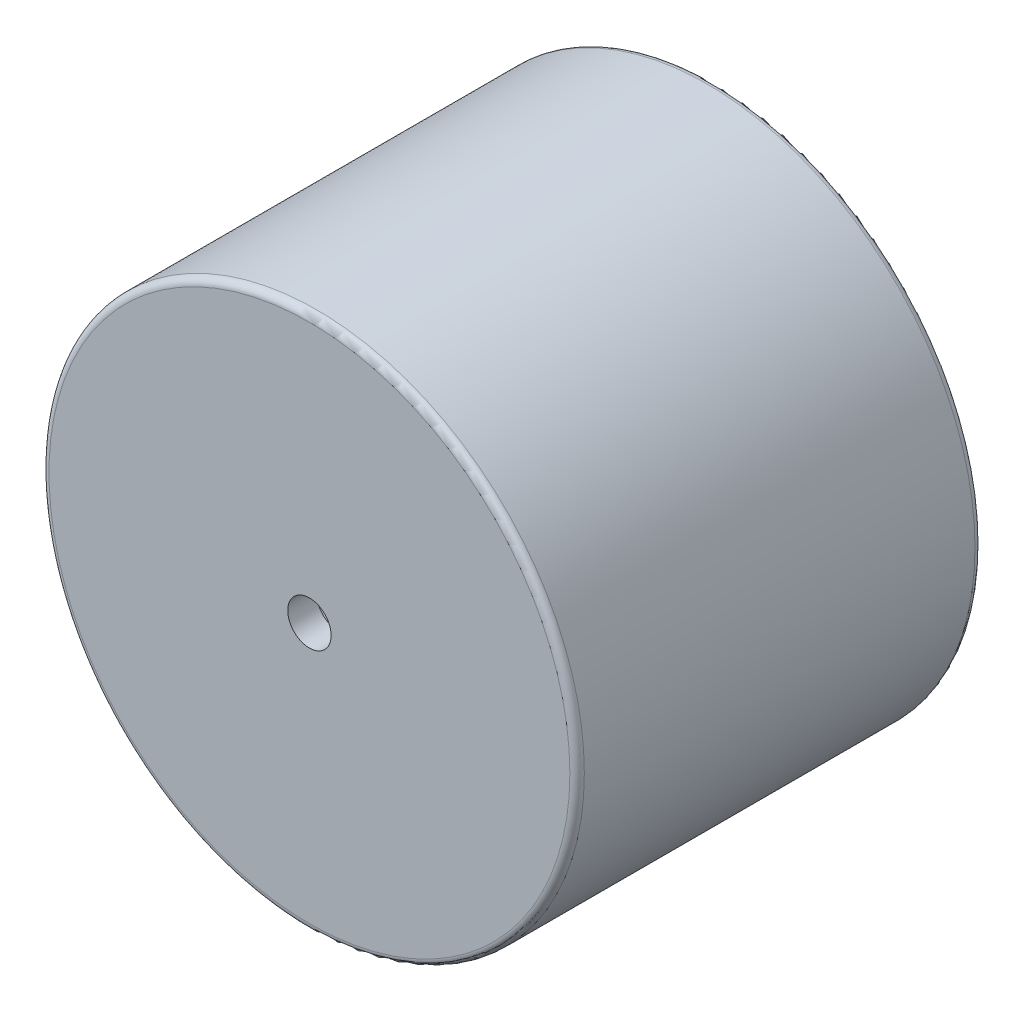
ISO-10303-21;
HEADER;
FILE_DESCRIPTION(('STEP AP214'),'2;1');
FILE_NAME('part.step','',(''),(''),'','','');
FILE_SCHEMA(('AUTOMOTIVE_DESIGN { 1 0 10303 214 1 1 1 1 }'));
ENDSEC;
DATA;
#1=APPLICATION_CONTEXT('core data for automotive mechanical design processes');
#2=APPLICATION_PROTOCOL_DEFINITION('international standard','automotive_design',2000,#1);
#3=PRODUCT_CONTEXT('',#1,'mechanical');
#4=PRODUCT('Part','Part','',(#3));
#5=PRODUCT_RELATED_PRODUCT_CATEGORY('part','',(#4));
#6=PRODUCT_DEFINITION_FORMATION('','',#4);
#7=PRODUCT_DEFINITION_CONTEXT('part definition',#1,'design');
#8=PRODUCT_DEFINITION('design','',#6,#7);
#9=PRODUCT_DEFINITION_SHAPE('','',#8);
#10=(LENGTH_UNIT() NAMED_UNIT(*) SI_UNIT(.MILLI.,.METRE.));
#11=(NAMED_UNIT(*) PLANE_ANGLE_UNIT() SI_UNIT($,.RADIAN.));
#12=(NAMED_UNIT(*) SI_UNIT($,.STERADIAN.) SOLID_ANGLE_UNIT());
#13=UNCERTAINTY_MEASURE_WITH_UNIT(LENGTH_MEASURE(1.E-05),#10,'distance_accuracy_value','');
#14=(GEOMETRIC_REPRESENTATION_CONTEXT(3) GLOBAL_UNCERTAINTY_ASSIGNED_CONTEXT((#13)) GLOBAL_UNIT_ASSIGNED_CONTEXT((#10,
#11,#12)) REPRESENTATION_CONTEXT('',''));
#15=CARTESIAN_POINT('',(0.,0.,0.));
#16=DIRECTION('',(0.,0.,1.));
#17=DIRECTION('',(1.,0.,0.));
#18=AXIS2_PLACEMENT_3D('',#15,#16,#17);
#19=CARTESIAN_POINT('',(0.,0.,2.));
#20=DIRECTION('',(0.,0.,1.));
#21=DIRECTION('',(1.,0.,0.));
#22=AXIS2_PLACEMENT_3D('',#19,#20,#21);
#23=PLANE('',#22);
#24=CARTESIAN_POINT('',(15.,0.,2.));
#25=DIRECTION('',(0.,0.,1.));
#26=DIRECTION('',(1.,0.,0.));
#27=AXIS2_PLACEMENT_3D('',#24,#25,#26);
#28=CIRCLE('',#27,1.);
#29=CARTESIAN_POINT('',(16.,0.,2.));
#30=VERTEX_POINT('',#29);
#31=EDGE_CURVE('E107',#30,#30,#28,.F.);
#32=ORIENTED_EDGE('',*,*,#31,.T.);
#33=EDGE_LOOP('',(#32));
#34=FACE_BOUND('',#33,.T.);
#35=CARTESIAN_POINT('',(7.49999999999999,-12.9903810567666,2.));
#36=DIRECTION('',(0.,0.,1.));
#37=DIRECTION('',(1.,0.,0.));
#38=AXIS2_PLACEMENT_3D('',#35,#36,#37);
#39=CIRCLE('',#38,1.);
#40=CARTESIAN_POINT('',(8.49999999999999,-12.9903810567666,2.));
#41=VERTEX_POINT('',#40);
#42=EDGE_CURVE('E105',#41,#41,#39,.F.);
#43=ORIENTED_EDGE('',*,*,#42,.T.);
#44=EDGE_LOOP('',(#43));
#45=FACE_BOUND('',#44,.T.);
#46=CARTESIAN_POINT('',(-7.50000000000001,-12.9903810567666,2.));
#47=DIRECTION('',(0.,0.,1.));
#48=DIRECTION('',(1.,0.,0.));
#49=AXIS2_PLACEMENT_3D('',#46,#47,#48);
#50=CIRCLE('',#49,1.);
#51=CARTESIAN_POINT('',(-6.5,-12.9903810567666,2.));
#52=VERTEX_POINT('',#51);
#53=EDGE_CURVE('E120',#52,#52,#50,.F.);
#54=ORIENTED_EDGE('',*,*,#53,.T.);
#55=EDGE_LOOP('',(#54));
#56=FACE_BOUND('',#55,.T.);
#57=CARTESIAN_POINT('',(-15.,0.,2.));
#58=DIRECTION('',(0.,0.,1.));
#59=DIRECTION('',(1.,0.,0.));
#60=AXIS2_PLACEMENT_3D('',#57,#58,#59);
#61=CIRCLE('',#60,1.);
#62=CARTESIAN_POINT('',(-14.,0.,2.));
#63=VERTEX_POINT('',#62);
#64=EDGE_CURVE('E133',#63,#63,#61,.F.);
#65=ORIENTED_EDGE('',*,*,#64,.T.);
#66=EDGE_LOOP('',(#65));
#67=FACE_BOUND('',#66,.T.);
#68=CARTESIAN_POINT('',(-7.5,12.9903810567666,2.));
#69=DIRECTION('',(0.,0.,1.));
#70=DIRECTION('',(1.,0.,0.));
#71=AXIS2_PLACEMENT_3D('',#68,#69,#70);
#72=CIRCLE('',#71,1.);
#73=CARTESIAN_POINT('',(-6.49999999999999,12.9903810567666,2.));
#74=VERTEX_POINT('',#73);
#75=EDGE_CURVE('E127',#74,#74,#72,.F.);
#76=ORIENTED_EDGE('',*,*,#75,.T.);
#77=EDGE_LOOP('',(#76));
#78=FACE_BOUND('',#77,.T.);
#79=CARTESIAN_POINT('',(7.50000000000001,12.9903810567666,2.));
#80=DIRECTION('',(0.,0.,1.));
#81=DIRECTION('',(1.,0.,0.));
#82=AXIS2_PLACEMENT_3D('',#79,#80,#81);
#83=CIRCLE('',#82,1.);
#84=CARTESIAN_POINT('',(8.50000000000001,12.9903810567666,2.));
#85=VERTEX_POINT('',#84);
#86=EDGE_CURVE('E121',#85,#85,#83,.F.);
#87=ORIENTED_EDGE('',*,*,#86,.T.);
#88=EDGE_LOOP('',(#87));
#89=FACE_BOUND('',#88,.T.);
#90=CARTESIAN_POINT('',(-5.39168837326284,-7.82174510487412,2.));
#91=DIRECTION('',(0.,0.,1.));
#92=DIRECTION('',(1.,0.,0.));
#93=AXIS2_PLACEMENT_3D('',#90,#91,#92);
#94=CIRCLE('',#93,3.);
#95=CARTESIAN_POINT('',(-2.39168837326284,-7.82174510487412,2.));
#96=VERTEX_POINT('',#95);
#97=EDGE_CURVE('E146',#96,#96,#94,.F.);
#98=ORIENTED_EDGE('',*,*,#97,.T.);
#99=EDGE_LOOP('',(#98));
#100=FACE_BOUND('',#99,.T.);
#101=CARTESIAN_POINT('',(0.,0.,2.));
#102=DIRECTION('',(0.,0.,1.));
#103=DIRECTION('',(1.,0.,0.));
#104=AXIS2_PLACEMENT_3D('',#101,#102,#103);
#105=CIRCLE('',#104,16.5);
#106=CARTESIAN_POINT('',(-14.2894191624433,8.24999999999992,2.));
#107=VERTEX_POINT('',#106);
#108=CARTESIAN_POINT('',(14.2894191624433,-8.24999999999991,2.));
#109=VERTEX_POINT('',#108);
#110=EDGE_CURVE('E155',#107,#109,#105,.T.);
#111=ORIENTED_EDGE('',*,*,#110,.T.);
#112=CARTESIAN_POINT('',(12.9903810567666,-7.49999999999993,2.));
#113=DIRECTION('',(0.,0.,1.));
#114=DIRECTION('',(1.,0.,0.));
#115=AXIS2_PLACEMENT_3D('',#112,#113,#114);
#116=CIRCLE('',#115,1.5);
#117=EDGE_CURVE('E56',#109,#109,#116,.F.);
#118=ORIENTED_EDGE('',*,*,#117,.T.);
#119=EDGE_CURVE('E159',#109,#107,#105,.T.);
#120=ORIENTED_EDGE('',*,*,#119,.T.);
#121=CARTESIAN_POINT('',(-12.9903810567666,7.49999999999992,2.));
#122=DIRECTION('',(0.,0.,1.));
#123=DIRECTION('',(1.,0.,0.));
#124=AXIS2_PLACEMENT_3D('',#121,#122,#123);
#125=CIRCLE('',#124,1.5);
#126=EDGE_CURVE('E61',#107,#107,#125,.F.);
#127=ORIENTED_EDGE('',*,*,#126,.T.);
#128=EDGE_LOOP('',(#111,#118,#120,#127));
#129=FACE_BOUND('',#128,.T.);
#130=ADVANCED_FACE('F38',(#34,#45,#56,#67,#78,#89,#100,#129),#23,.T.);
#131=CARTESIAN_POINT('',(0.,0.,28.));
#132=DIRECTION('',(0.,0.,-1.));
#133=DIRECTION('',(-1.,0.,0.));
#134=AXIS2_PLACEMENT_3D('',#131,#132,#133);
#135=CYLINDRICAL_SURFACE('',#134,16.5);
#136=ORIENTED_EDGE('',*,*,#110,.F.);
#137=ORIENTED_EDGE('',*,*,#119,.F.);
#138=EDGE_LOOP('',(#136,#137));
#139=FACE_BOUND('',#138,.T.);
#140=CARTESIAN_POINT('',(0.,0.,26.));
#141=DIRECTION('',(0.,0.,1.));
#142=DIRECTION('',(1.,0.,0.));
#143=AXIS2_PLACEMENT_3D('',#140,#141,#142);
#144=CIRCLE('',#143,16.5);
#145=CARTESIAN_POINT('',(16.5,0.,26.));
#146=VERTEX_POINT('',#145);
#147=EDGE_CURVE('E154',#146,#146,#144,.T.);
#148=ORIENTED_EDGE('',*,*,#147,.T.);
#149=EDGE_LOOP('',(#148));
#150=FACE_BOUND('',#149,.T.);
#151=ADVANCED_FACE('F230',(#139,#150),#135,.F.);
#152=CARTESIAN_POINT('',(0.,0.,26.));
#153=DIRECTION('',(0.,0.,1.));
#154=DIRECTION('',(1.,0.,0.));
#155=AXIS2_PLACEMENT_3D('',#152,#153,#154);
#156=PLANE('',#155);
#157=CARTESIAN_POINT('',(0.,0.,26.));
#158=DIRECTION('',(0.,0.,1.));
#159=DIRECTION('',(1.,0.,0.));
#160=AXIS2_PLACEMENT_3D('',#157,#158,#159);
#161=CIRCLE('',#160,1.5);
#162=CARTESIAN_POINT('',(1.5,0.,26.));
#163=VERTEX_POINT('',#162);
#164=EDGE_CURVE('E143',#163,#163,#161,.F.);
#165=ORIENTED_EDGE('',*,*,#164,.F.);
#166=EDGE_LOOP('',(#165));
#167=FACE_BOUND('',#166,.T.);
#168=ORIENTED_EDGE('',*,*,#147,.F.);
#169=EDGE_LOOP('',(#168));
#170=FACE_BOUND('',#169,.T.);
#171=ADVANCED_FACE('F218',(#167,#170),#156,.F.);
#172=CARTESIAN_POINT('',(0.,0.,28.));
#173=DIRECTION('',(0.,0.,-1.));
#174=DIRECTION('',(-1.,0.,0.));
#175=AXIS2_PLACEMENT_3D('',#172,#173,#174);
#176=CYLINDRICAL_SURFACE('',#175,18.5);
#177=CARTESIAN_POINT('',(0.,0.,27.5));
#178=DIRECTION('',(0.,0.,1.));
#179=DIRECTION('',(1.,0.,0.));
#180=AXIS2_PLACEMENT_3D('',#177,#178,#179);
#181=CIRCLE('',#180,18.5);
#182=CARTESIAN_POINT('',(18.5,0.,27.5));
#183=VERTEX_POINT('',#182);
#184=EDGE_CURVE('E170',#183,#183,#181,.F.);
#185=ORIENTED_EDGE('',*,*,#184,.T.);
#186=EDGE_LOOP('',(#185));
#187=FACE_BOUND('',#186,.T.);
#188=CARTESIAN_POINT('',(0.,0.,0.5));
#189=DIRECTION('',(0.,0.,1.));
#190=DIRECTION('',(1.,0.,0.));
#191=AXIS2_PLACEMENT_3D('',#188,#189,#190);
#192=CIRCLE('',#191,18.5);
#193=CARTESIAN_POINT('',(18.5,0.,0.5));
#194=VERTEX_POINT('',#193);
#195=EDGE_CURVE('E167',#194,#194,#192,.T.);
#196=ORIENTED_EDGE('',*,*,#195,.T.);
#197=EDGE_LOOP('',(#196));
#198=FACE_BOUND('',#197,.T.);
#199=ADVANCED_FACE('F214',(#187,#198),#176,.T.);
#200=CARTESIAN_POINT('',(0.,0.,28.));
#201=DIRECTION('',(0.,0.,1.));
#202=DIRECTION('',(1.,0.,0.));
#203=AXIS2_PLACEMENT_3D('',#200,#201,#202);
#204=PLANE('',#203);
#205=CARTESIAN_POINT('',(0.,0.,28.));
#206=DIRECTION('',(0.,0.,1.));
#207=DIRECTION('',(1.,0.,0.));
#208=AXIS2_PLACEMENT_3D('',#205,#206,#207);
#209=CIRCLE('',#208,18.);
#210=CARTESIAN_POINT('',(18.,0.,28.));
#211=VERTEX_POINT('',#210);
#212=EDGE_CURVE('E164',#211,#211,#209,.T.);
#213=ORIENTED_EDGE('',*,*,#212,.T.);
#214=EDGE_LOOP('',(#213));
#215=FACE_BOUND('',#214,.T.);
#216=CARTESIAN_POINT('',(0.,0.,28.));
#217=DIRECTION('',(0.,0.,1.));
#218=DIRECTION('',(1.,0.,0.));
#219=AXIS2_PLACEMENT_3D('',#216,#217,#218);
#220=CIRCLE('',#219,1.5);
#221=CARTESIAN_POINT('',(1.5,0.,28.));
#222=VERTEX_POINT('',#221);
#223=EDGE_CURVE('E114',#222,#222,#220,.T.);
#224=ORIENTED_EDGE('',*,*,#223,.F.);
#225=EDGE_LOOP('',(#224));
#226=FACE_BOUND('',#225,.T.);
#227=ADVANCED_FACE('F217',(#215,#226),#204,.T.);
#228=CARTESIAN_POINT('',(0.,0.,0.));
#229=DIRECTION('',(0.,0.,1.));
#230=DIRECTION('',(1.,0.,0.));
#231=AXIS2_PLACEMENT_3D('',#228,#229,#230);
#232=PLANE('',#231);
#233=CARTESIAN_POINT('',(12.9903810567666,-7.49999999999993,0.));
#234=DIRECTION('',(0.,0.,-1.));
#235=DIRECTION('',(-1.,0.,0.));
#236=AXIS2_PLACEMENT_3D('',#233,#234,#235);
#237=CIRCLE('',#236,1.5);
#238=CARTESIAN_POINT('',(11.4903810567666,-7.49999999999993,0.));
#239=VERTEX_POINT('',#238);
#240=EDGE_CURVE('E99',#239,#239,#237,.T.);
#241=ORIENTED_EDGE('',*,*,#240,.F.);
#242=EDGE_LOOP('',(#241));
#243=FACE_BOUND('',#242,.T.);
#244=CARTESIAN_POINT('',(-12.9903810567666,7.49999999999992,0.));
#245=DIRECTION('',(0.,0.,-1.));
#246=DIRECTION('',(-1.,0.,0.));
#247=AXIS2_PLACEMENT_3D('',#244,#245,#246);
#248=CIRCLE('',#247,1.5);
#249=CARTESIAN_POINT('',(-14.4903810567666,7.49999999999992,0.));
#250=VERTEX_POINT('',#249);
#251=EDGE_CURVE('E292',#250,#250,#248,.T.);
#252=ORIENTED_EDGE('',*,*,#251,.F.);
#253=EDGE_LOOP('',(#252));
#254=FACE_BOUND('',#253,.T.);
#255=CARTESIAN_POINT('',(0.,0.,0.));
#256=DIRECTION('',(0.,0.,1.));
#257=DIRECTION('',(1.,0.,0.));
#258=AXIS2_PLACEMENT_3D('',#255,#256,#257);
#259=CIRCLE('',#258,10.6541705656237);
#260=CARTESIAN_POINT('',(-1.50180833040901,-10.5477922893901,0.));
#261=VERTEX_POINT('',#260);
#262=CARTESIAN_POINT('',(-9.32331892913122,-5.15626556599897,0.));
#263=VERTEX_POINT('',#262);
#264=EDGE_CURVE('E184',#261,#263,#259,.T.);
#265=ORIENTED_EDGE('',*,*,#264,.T.);
#266=CARTESIAN_POINT('',(-5.39168837326284,-7.82174510487412,0.));
#267=DIRECTION('',(0.,0.,1.));
#268=DIRECTION('',(1.,0.,0.));
#269=AXIS2_PLACEMENT_3D('',#266,#267,#268);
#270=CIRCLE('',#269,4.75);
#271=EDGE_CURVE('E187',#263,#261,#270,.F.);
#272=ORIENTED_EDGE('',*,*,#271,.T.);
#273=EDGE_LOOP('',(#265,#272));
#274=FACE_BOUND('',#273,.T.);
#275=CARTESIAN_POINT('',(15.,0.,0.));
#276=DIRECTION('',(0.,0.,-1.));
#277=DIRECTION('',(-1.,0.,0.));
#278=AXIS2_PLACEMENT_3D('',#275,#276,#277);
#279=CIRCLE('',#278,1.);
#280=CARTESIAN_POINT('',(14.,0.,0.));
#281=VERTEX_POINT('',#280);
#282=EDGE_CURVE('E110',#281,#281,#279,.T.);
#283=ORIENTED_EDGE('',*,*,#282,.F.);
#284=EDGE_LOOP('',(#283));
#285=FACE_BOUND('',#284,.T.);
#286=CARTESIAN_POINT('',(7.49999999999999,-12.9903810567666,0.));
#287=DIRECTION('',(0.,0.,-1.));
#288=DIRECTION('',(-1.,0.,0.));
#289=AXIS2_PLACEMENT_3D('',#286,#287,#288);
#290=CIRCLE('',#289,1.);
#291=CARTESIAN_POINT('',(6.49999999999999,-12.9903810567666,0.));
#292=VERTEX_POINT('',#291);
#293=EDGE_CURVE('E117',#292,#292,#290,.T.);
#294=ORIENTED_EDGE('',*,*,#293,.F.);
#295=EDGE_LOOP('',(#294));
#296=FACE_BOUND('',#295,.T.);
#297=CARTESIAN_POINT('',(-7.50000000000001,-12.9903810567666,0.));
#298=DIRECTION('',(0.,0.,-1.));
#299=DIRECTION('',(-1.,0.,0.));
#300=AXIS2_PLACEMENT_3D('',#297,#298,#299);
#301=CIRCLE('',#300,1.);
#302=CARTESIAN_POINT('',(-8.50000000000001,-12.9903810567666,0.));
#303=VERTEX_POINT('',#302);
#304=EDGE_CURVE('E136',#303,#303,#301,.T.);
#305=ORIENTED_EDGE('',*,*,#304,.F.);
#306=EDGE_LOOP('',(#305));
#307=FACE_BOUND('',#306,.T.);
#308=CARTESIAN_POINT('',(-15.,0.,0.));
#309=DIRECTION('',(0.,0.,-1.));
#310=DIRECTION('',(-1.,0.,0.));
#311=AXIS2_PLACEMENT_3D('',#308,#309,#310);
#312=CIRCLE('',#311,1.);
#313=CARTESIAN_POINT('',(-16.,0.,0.));
#314=VERTEX_POINT('',#313);
#315=EDGE_CURVE('E130',#314,#314,#312,.T.);
#316=ORIENTED_EDGE('',*,*,#315,.F.);
#317=EDGE_LOOP('',(#316));
#318=FACE_BOUND('',#317,.T.);
#319=CARTESIAN_POINT('',(-7.5,12.9903810567666,0.));
#320=DIRECTION('',(0.,0.,-1.));
#321=DIRECTION('',(-1.,0.,0.));
#322=AXIS2_PLACEMENT_3D('',#319,#320,#321);
#323=CIRCLE('',#322,1.);
#324=CARTESIAN_POINT('',(-8.5,12.9903810567666,0.));
#325=VERTEX_POINT('',#324);
#326=EDGE_CURVE('E124',#325,#325,#323,.T.);
#327=ORIENTED_EDGE('',*,*,#326,.F.);
#328=EDGE_LOOP('',(#327));
#329=FACE_BOUND('',#328,.T.);
#330=CARTESIAN_POINT('',(7.50000000000001,12.9903810567666,0.));
#331=DIRECTION('',(0.,0.,-1.));
#332=DIRECTION('',(-1.,0.,0.));
#333=AXIS2_PLACEMENT_3D('',#330,#331,#332);
#334=CIRCLE('',#333,1.);
#335=CARTESIAN_POINT('',(6.5,12.9903810567666,0.));
#336=VERTEX_POINT('',#335);
#337=EDGE_CURVE('E111',#336,#336,#334,.T.);
#338=ORIENTED_EDGE('',*,*,#337,.F.);
#339=EDGE_LOOP('',(#338));
#340=FACE_BOUND('',#339,.T.);
#341=CARTESIAN_POINT('',(0.,0.,0.));
#342=DIRECTION('',(0.,0.,1.));
#343=DIRECTION('',(1.,0.,0.));
#344=AXIS2_PLACEMENT_3D('',#341,#342,#343);
#345=CIRCLE('',#344,18.);
#346=CARTESIAN_POINT('',(18.,0.,0.));
#347=VERTEX_POINT('',#346);
#348=EDGE_CURVE('E173',#347,#347,#345,.F.);
#349=ORIENTED_EDGE('',*,*,#348,.T.);
#350=EDGE_LOOP('',(#349));
#351=FACE_BOUND('',#350,.T.);
#352=CARTESIAN_POINT('',(-5.39168837326284,-7.82174510487412,0.));
#353=DIRECTION('',(0.,0.,1.));
#354=DIRECTION('',(1.,0.,0.));
#355=AXIS2_PLACEMENT_3D('',#352,#353,#354);
#356=CIRCLE('',#355,4.);
#357=CARTESIAN_POINT('',(-1.39168837326284,-7.82174510487412,0.));
#358=VERTEX_POINT('',#357);
#359=EDGE_CURVE('E158',#358,#358,#356,.F.);
#360=ORIENTED_EDGE('',*,*,#359,.F.);
#361=EDGE_LOOP('',(#360));
#362=FACE_BOUND('',#361,.T.);
#363=ADVANCED_FACE('F220',(#243,#254,#274,#285,#296,#307,#318,#329,#340,#351,#362),#232,.F.);
#364=CARTESIAN_POINT('',(-5.39168837326284,-7.82174510487412,-10.));
#365=DIRECTION('',(0.,0.,-1.));
#366=DIRECTION('',(-1.,0.,0.));
#367=AXIS2_PLACEMENT_3D('',#364,#365,#366);
#368=PLANE('',#367);
#369=CARTESIAN_POINT('',(-5.39168837326284,-7.82174510487412,-10.));
#370=DIRECTION('',(0.,0.,-1.));
#371=DIRECTION('',(-1.,0.,0.));
#372=AXIS2_PLACEMENT_3D('',#369,#370,#371);
#373=CIRCLE('',#372,3.5);
#374=CARTESIAN_POINT('',(-8.89168837326284,-7.82174510487412,-10.));
#375=VERTEX_POINT('',#374);
#376=EDGE_CURVE('E176',#375,#375,#373,.T.);
#377=ORIENTED_EDGE('',*,*,#376,.T.);
#378=EDGE_LOOP('',(#377));
#379=FACE_BOUND('',#378,.T.);
#380=CARTESIAN_POINT('',(-5.39168837326284,-7.82174510487412,-10.));
#381=DIRECTION('',(0.,0.,-1.));
#382=DIRECTION('',(-1.,0.,0.));
#383=AXIS2_PLACEMENT_3D('',#380,#381,#382);
#384=CIRCLE('',#383,3.);
#385=CARTESIAN_POINT('',(-8.39168837326284,-7.82174510487412,-10.));
#386=VERTEX_POINT('',#385);
#387=EDGE_CURVE('E151',#386,#386,#384,.T.);
#388=ORIENTED_EDGE('',*,*,#387,.F.);
#389=EDGE_LOOP('',(#388));
#390=FACE_BOUND('',#389,.T.);
#391=ADVANCED_FACE('F223',(#379,#390),#368,.T.);
#392=CARTESIAN_POINT('',(-5.39168837326284,-7.82174510487412,-10.));
#393=DIRECTION('',(0.,0.,1.));
#394=DIRECTION('',(1.,0.,0.));
#395=AXIS2_PLACEMENT_3D('',#392,#393,#394);
#396=CYLINDRICAL_SURFACE('',#395,4.);
#397=CARTESIAN_POINT('',(-5.39168837326284,-7.82174510487412,-9.5));
#398=DIRECTION('',(0.,0.,-1.));
#399=DIRECTION('',(-1.,0.,0.));
#400=AXIS2_PLACEMENT_3D('',#397,#398,#399);
#401=CIRCLE('',#400,4.);
#402=CARTESIAN_POINT('',(-9.39168837326284,-7.82174510487412,-9.5));
#403=VERTEX_POINT('',#402);
#404=EDGE_CURVE('E179',#403,#403,#401,.F.);
#405=ORIENTED_EDGE('',*,*,#404,.T.);
#406=EDGE_LOOP('',(#405));
#407=FACE_BOUND('',#406,.T.);
#408=ORIENTED_EDGE('',*,*,#359,.T.);
#409=EDGE_LOOP('',(#408));
#410=FACE_BOUND('',#409,.T.);
#411=ADVANCED_FACE('F238',(#407,#410),#396,.T.);
#412=CARTESIAN_POINT('',(-5.39168837326284,-7.82174510487412,-10.));
#413=DIRECTION('',(0.,0.,1.));
#414=DIRECTION('',(1.,0.,0.));
#415=AXIS2_PLACEMENT_3D('',#412,#413,#414);
#416=CYLINDRICAL_SURFACE('',#415,3.);
#417=ORIENTED_EDGE('',*,*,#387,.T.);
#418=EDGE_LOOP('',(#417));
#419=FACE_BOUND('',#418,.T.);
#420=ORIENTED_EDGE('',*,*,#97,.F.);
#421=EDGE_LOOP('',(#420));
#422=FACE_BOUND('',#421,.T.);
#423=ADVANCED_FACE('F241',(#419,#422),#416,.F.);
#424=CARTESIAN_POINT('',(0.,0.,-10.001));
#425=DIRECTION('',(0.,0.,1.));
#426=DIRECTION('',(1.,0.,0.));
#427=AXIS2_PLACEMENT_3D('',#424,#425,#426);
#428=CYLINDRICAL_SURFACE('',#427,1.5);
#429=ORIENTED_EDGE('',*,*,#223,.T.);
#430=EDGE_LOOP('',(#429));
#431=FACE_BOUND('',#430,.T.);
#432=ORIENTED_EDGE('',*,*,#164,.T.);
#433=EDGE_LOOP('',(#432));
#434=FACE_BOUND('',#433,.T.);
#435=ADVANCED_FACE('F212',(#431,#434),#428,.F.);
#436=CARTESIAN_POINT('',(0.,0.,27.5));
#437=DIRECTION('',(0.,0.,1.));
#438=DIRECTION('',(1.,0.,0.));
#439=AXIS2_PLACEMENT_3D('',#436,#437,#438);
#440=TOROIDAL_SURFACE('',#439,18.,0.5);
#441=ORIENTED_EDGE('',*,*,#184,.F.);
#442=EDGE_LOOP('',(#441));
#443=FACE_BOUND('',#442,.T.);
#444=ORIENTED_EDGE('',*,*,#212,.F.);
#445=EDGE_LOOP('',(#444));
#446=FACE_BOUND('',#445,.T.);
#447=ADVANCED_FACE('F208',(#443,#446),#440,.T.);
#448=CARTESIAN_POINT('',(0.,0.,0.5));
#449=DIRECTION('',(0.,0.,1.));
#450=DIRECTION('',(1.,0.,0.));
#451=AXIS2_PLACEMENT_3D('',#448,#449,#450);
#452=TOROIDAL_SURFACE('',#451,18.,0.5);
#453=ORIENTED_EDGE('',*,*,#348,.F.);
#454=EDGE_LOOP('',(#453));
#455=FACE_BOUND('',#454,.T.);
#456=ORIENTED_EDGE('',*,*,#195,.F.);
#457=EDGE_LOOP('',(#456));
#458=FACE_BOUND('',#457,.T.);
#459=ADVANCED_FACE('F204',(#455,#458),#452,.T.);
#460=CARTESIAN_POINT('',(-5.39168837326284,-7.82174510487412,-9.5));
#461=DIRECTION('',(0.,0.,-1.));
#462=DIRECTION('',(-1.,0.,0.));
#463=AXIS2_PLACEMENT_3D('',#460,#461,#462);
#464=TOROIDAL_SURFACE('',#463,3.5,0.5);
#465=ORIENTED_EDGE('',*,*,#404,.F.);
#466=EDGE_LOOP('',(#465));
#467=FACE_BOUND('',#466,.T.);
#468=ORIENTED_EDGE('',*,*,#376,.F.);
#469=EDGE_LOOP('',(#468));
#470=FACE_BOUND('',#469,.T.);
#471=ADVANCED_FACE('F199',(#467,#470),#464,.T.);
#472=CARTESIAN_POINT('',(7.50000000000001,12.9903810567666,28.001));
#473=DIRECTION('',(0.,0.,-1.));
#474=DIRECTION('',(-1.,0.,0.));
#475=AXIS2_PLACEMENT_3D('',#472,#473,#474);
#476=CYLINDRICAL_SURFACE('',#475,1.);
#477=ORIENTED_EDGE('',*,*,#86,.F.);
#478=EDGE_LOOP('',(#477));
#479=FACE_BOUND('',#478,.T.);
#480=ORIENTED_EDGE('',*,*,#337,.T.);
#481=EDGE_LOOP('',(#480));
#482=FACE_BOUND('',#481,.T.);
#483=ADVANCED_FACE('F203',(#479,#482),#476,.F.);
#484=CARTESIAN_POINT('',(-7.5,12.9903810567666,28.001));
#485=DIRECTION('',(0.,0.,-1.));
#486=DIRECTION('',(-1.,0.,0.));
#487=AXIS2_PLACEMENT_3D('',#484,#485,#486);
#488=CYLINDRICAL_SURFACE('',#487,1.);
#489=ORIENTED_EDGE('',*,*,#75,.F.);
#490=EDGE_LOOP('',(#489));
#491=FACE_BOUND('',#490,.T.);
#492=ORIENTED_EDGE('',*,*,#326,.T.);
#493=EDGE_LOOP('',(#492));
#494=FACE_BOUND('',#493,.T.);
#495=ADVANCED_FACE('F260',(#491,#494),#488,.F.);
#496=CARTESIAN_POINT('',(-15.,0.,28.001));
#497=DIRECTION('',(0.,0.,-1.));
#498=DIRECTION('',(-1.,0.,0.));
#499=AXIS2_PLACEMENT_3D('',#496,#497,#498);
#500=CYLINDRICAL_SURFACE('',#499,1.);
#501=ORIENTED_EDGE('',*,*,#64,.F.);
#502=EDGE_LOOP('',(#501));
#503=FACE_BOUND('',#502,.T.);
#504=ORIENTED_EDGE('',*,*,#315,.T.);
#505=EDGE_LOOP('',(#504));
#506=FACE_BOUND('',#505,.T.);
#507=ADVANCED_FACE('F256',(#503,#506),#500,.F.);
#508=CARTESIAN_POINT('',(-7.50000000000001,-12.9903810567666,28.001));
#509=DIRECTION('',(0.,0.,-1.));
#510=DIRECTION('',(-1.,0.,0.));
#511=AXIS2_PLACEMENT_3D('',#508,#509,#510);
#512=CYLINDRICAL_SURFACE('',#511,1.);
#513=ORIENTED_EDGE('',*,*,#53,.F.);
#514=EDGE_LOOP('',(#513));
#515=FACE_BOUND('',#514,.T.);
#516=ORIENTED_EDGE('',*,*,#304,.T.);
#517=EDGE_LOOP('',(#516));
#518=FACE_BOUND('',#517,.T.);
#519=ADVANCED_FACE('F252',(#515,#518),#512,.F.);
#520=CARTESIAN_POINT('',(7.49999999999999,-12.9903810567666,28.001));
#521=DIRECTION('',(0.,0.,-1.));
#522=DIRECTION('',(-1.,0.,0.));
#523=AXIS2_PLACEMENT_3D('',#520,#521,#522);
#524=CYLINDRICAL_SURFACE('',#523,1.);
#525=ORIENTED_EDGE('',*,*,#42,.F.);
#526=EDGE_LOOP('',(#525));
#527=FACE_BOUND('',#526,.T.);
#528=ORIENTED_EDGE('',*,*,#293,.T.);
#529=EDGE_LOOP('',(#528));
#530=FACE_BOUND('',#529,.T.);
#531=ADVANCED_FACE('F255',(#527,#530),#524,.F.);
#532=CARTESIAN_POINT('',(15.,0.,28.001));
#533=DIRECTION('',(0.,0.,-1.));
#534=DIRECTION('',(-1.,0.,0.));
#535=AXIS2_PLACEMENT_3D('',#532,#533,#534);
#536=CYLINDRICAL_SURFACE('',#535,1.);
#537=ORIENTED_EDGE('',*,*,#31,.F.);
#538=EDGE_LOOP('',(#537));
#539=FACE_BOUND('',#538,.T.);
#540=ORIENTED_EDGE('',*,*,#282,.T.);
#541=EDGE_LOOP('',(#540));
#542=FACE_BOUND('',#541,.T.);
#543=ADVANCED_FACE('F270',(#539,#542),#536,.F.);
#544=CARTESIAN_POINT('',(-5.39168837326284,-7.82174510487412,0.5));
#545=DIRECTION('',(0.,0.,-1.));
#546=DIRECTION('',(-1.,0.,0.));
#547=AXIS2_PLACEMENT_3D('',#544,#545,#546);
#548=CYLINDRICAL_SURFACE('',#547,5.);
#549=DIRECTION('',(0.,0.,-1.));
#550=VECTOR('',#549,1.);
#551=CARTESIAN_POINT('',(-1.07698896834668,-10.3482781138048,0.5));
#552=LINE('',#551,#550);
#553=CARTESIAN_POINT('',(-1.07698896834668,-10.3482781138048,0.5));
#554=VERTEX_POINT('',#553);
#555=CARTESIAN_POINT('',(-1.07698896834668,-10.3482781138048,0.25));
#556=VERTEX_POINT('',#555);
#557=EDGE_CURVE('E94',#554,#556,#552,.T.);
#558=ORIENTED_EDGE('',*,*,#557,.T.);
#559=CARTESIAN_POINT('',(-5.39168837326284,-7.82174510487412,0.25));
#560=DIRECTION('',(0.,0.,1.));
#561=DIRECTION('',(1.,0.,0.));
#562=AXIS2_PLACEMENT_3D('',#559,#560,#561);
#563=CIRCLE('',#562,5.);
#564=CARTESIAN_POINT('',(-9.28800262726872,-4.68825898969337,0.25));
#565=VERTEX_POINT('',#564);
#566=EDGE_CURVE('E89',#556,#565,#563,.T.);
#567=ORIENTED_EDGE('',*,*,#566,.T.);
#568=DIRECTION('',(0.,0.,-1.));
#569=VECTOR('',#568,1.);
#570=CARTESIAN_POINT('',(-9.28800262726872,-4.68825898969337,0.5));
#571=LINE('',#570,#569);
#572=CARTESIAN_POINT('',(-9.28800262726872,-4.68825898969337,0.5));
#573=VERTEX_POINT('',#572);
#574=EDGE_CURVE('E82',#573,#565,#571,.T.);
#575=ORIENTED_EDGE('',*,*,#574,.F.);
#576=CARTESIAN_POINT('',(-5.39168837326284,-7.82174510487412,0.5));
#577=DIRECTION('',(0.,0.,1.));
#578=DIRECTION('',(-1.,0.,0.));
#579=AXIS2_PLACEMENT_3D('',#576,#577,#578);
#580=CIRCLE('',#579,5.);
#581=EDGE_CURVE('E86',#554,#573,#580,.T.);
#582=ORIENTED_EDGE('',*,*,#581,.F.);
#583=EDGE_LOOP('',(#558,#567,#575,#582));
#584=FACE_BOUND('',#583,.T.);
#585=ADVANCED_FACE('F85',(#584),#548,.T.);
#586=CARTESIAN_POINT('',(0.,0.,0.5));
#587=DIRECTION('',(0.,0.,-1.));
#588=DIRECTION('',(-1.,0.,0.));
#589=AXIS2_PLACEMENT_3D('',#586,#587,#588);
#590=CYLINDRICAL_SURFACE('',#589,10.4041705656237);
#591=ORIENTED_EDGE('',*,*,#574,.T.);
#592=CARTESIAN_POINT('',(0.,0.,0.25));
#593=DIRECTION('',(0.,0.,1.));
#594=DIRECTION('',(1.,0.,0.));
#595=AXIS2_PLACEMENT_3D('',#592,#593,#594);
#596=CIRCLE('',#595,10.4041705656237);
#597=EDGE_CURVE('E182',#565,#556,#596,.F.);
#598=ORIENTED_EDGE('',*,*,#597,.T.);
#599=ORIENTED_EDGE('',*,*,#557,.F.);
#600=CARTESIAN_POINT('',(0.,0.,0.5));
#601=DIRECTION('',(0.,0.,-1.));
#602=DIRECTION('',(-1.,0.,0.));
#603=AXIS2_PLACEMENT_3D('',#600,#601,#602);
#604=CIRCLE('',#603,10.4041705656237);
#605=EDGE_CURVE('E95',#573,#554,#604,.T.);
#606=ORIENTED_EDGE('',*,*,#605,.F.);
#607=EDGE_LOOP('',(#591,#598,#599,#606));
#608=FACE_BOUND('',#607,.T.);
#609=ADVANCED_FACE('F101',(#608),#590,.F.);
#610=CARTESIAN_POINT('',(-2.69584418663142,-3.91087255243706,0.5));
#611=DIRECTION('',(0.,0.,-1.));
#612=DIRECTION('',(-1.,0.,0.));
#613=AXIS2_PLACEMENT_3D('',#610,#611,#612);
#614=PLANE('',#613);
#615=ORIENTED_EDGE('',*,*,#581,.T.);
#616=ORIENTED_EDGE('',*,*,#605,.T.);
#617=EDGE_LOOP('',(#615,#616));
#618=FACE_BOUND('',#617,.T.);
#619=ADVANCED_FACE('F98',(#618),#614,.T.);
#620=CARTESIAN_POINT('',(0.,0.,0.25));
#621=DIRECTION('',(0.,0.,1.));
#622=DIRECTION('',(1.,0.,0.));
#623=AXIS2_PLACEMENT_3D('',#620,#621,#622);
#624=TOROIDAL_SURFACE('',#623,10.6541705656237,0.25);
#625=ORIENTED_EDGE('',*,*,#597,.F.);
#626=CARTESIAN_POINT('',(-9.28800262726872,-4.68825898969337,0.25));
#627=CARTESIAN_POINT('',(-9.28800031116809,-4.68824018191376,0.241869979225688));
#628=CARTESIAN_POINT('',(-9.28807921997377,-4.6889861595864,0.23376337537491));
#629=CARTESIAN_POINT('',(-9.28837880356064,-4.69183660141959,0.217875015772685));
#630=CARTESIAN_POINT('',(-9.28859806352857,-4.69392750899437,0.210090834435082));
#631=CARTESIAN_POINT('',(-9.28921929680938,-4.69988694386218,0.193311018225422));
#632=CARTESIAN_POINT('',(-9.28965062898605,-4.70404310176874,0.184419910619557));
#633=CARTESIAN_POINT('',(-9.29064691554801,-4.71374351839857,0.167414857768913));
#634=CARTESIAN_POINT('',(-9.29121240459757,-4.71929333668395,0.159304209583171));
#635=CARTESIAN_POINT('',(-9.2927323272102,-4.7344006616668,0.140140778388077));
#636=CARTESIAN_POINT('',(-9.29374156743334,-4.74458940499489,0.12959378352996));
#637=CARTESIAN_POINT('',(-9.29585586707936,-4.76643118600242,0.110181770320544));
#638=CARTESIAN_POINT('',(-9.29696110778749,-4.77808701357775,0.101320039597967));
#639=CARTESIAN_POINT('',(-9.30002194293187,-4.81122444847493,0.0790919664626302));
#640=CARTESIAN_POINT('',(-9.30200878608601,-4.83366252109688,0.0671654919576841));
#641=CARTESIAN_POINT('',(-9.30589910803254,-4.88002223398109,0.0466862475963936));
#642=CARTESIAN_POINT('',(-9.30780233447258,-4.90394790047248,0.0381431397096238));
#643=CARTESIAN_POINT('',(-9.3123400527632,-4.96465445229906,0.0202947379307669));
#644=CARTESIAN_POINT('',(-9.31487089638391,-5.00194298472071,0.0127006732892721));
#645=CARTESIAN_POINT('',(-9.31941683939548,-5.077134176923,0.00262970141716889));
#646=CARTESIAN_POINT('',(-9.32143275257497,-5.11503576575038,0.000144675564442066));
#647=CARTESIAN_POINT('',(-9.3232175904114,-5.15403528400894,2.06144011053955E-06));
#648=CARTESIAN_POINT('',(-9.32326838233661,-5.15515043697609,1.66716213745459E-08));
#649=CARTESIAN_POINT('',(-9.32331892913122,-5.15626556599897,0.));
#650=B_SPLINE_CURVE_WITH_KNOTS('',3,(#626,#627,#628,#629,#630,#631,#632,#633,#634,#635,#636,
#637,#638,#639,#640,#641,#642,#643,#644,#645,#646,#647,#648,#649),.UNSPECIFIED.,.F.,.F.,(4,2,2,
2,2,2,2,2,2,2,2,4),(0.,0.0243175652907655,0.0483937765434577,0.0777041048281182,
0.107133268166354,0.150983118827406,0.194917653855476,0.27095468720719,0.347207322251645,
0.461157777016787,0.574927016094309,0.578275939929524),.UNSPECIFIED.);
#651=EDGE_CURVE('E51',#565,#263,#650,.T.);
#652=ORIENTED_EDGE('',*,*,#651,.T.);
#653=ORIENTED_EDGE('',*,*,#264,.F.);
#654=CARTESIAN_POINT('',(-1.07698896834668,-10.3482781138048,0.25));
#655=CARTESIAN_POINT('',(-1.07697221521337,-10.3482692577661,0.241869979225687));
#656=CARTESIAN_POINT('',(-1.07764130819804,-10.3486084094513,0.23376337537491));
#657=CARTESIAN_POINT('',(-1.08019865521661,-10.349902528919,0.217875015772685));
#658=CARTESIAN_POINT('',(-1.08207474305605,-10.3508513512619,0.210090834435082));
#659=CARTESIAN_POINT('',(-1.08742322021063,-10.3535522005469,0.193311018225422));
#660=CARTESIAN_POINT('',(-1.09115397471424,-10.3554339993737,0.184419910619557));
#661=CARTESIAN_POINT('',(-1.09986521880696,-10.3598163384823,0.167414857768912));
#662=CARTESIAN_POINT('',(-1.1048507139644,-10.3623193564409,0.15930420958317));
#663=CARTESIAN_POINT('',(-1.1184287846412,-10.3691147541174,0.140140778388077));
#664=CARTESIAN_POINT('',(-1.12759179488748,-10.3736829375266,0.12959378352996));
#665=CARTESIAN_POINT('',(-1.14725220821573,-10.3834298246367,0.110181770320545));
#666=CARTESIAN_POINT('',(-1.15775215414889,-10.3886096903579,0.101320039597968));
#667=CARTESIAN_POINT('',(-1.18763237093626,-10.4032599786856,0.0790919664626304));
#668=CARTESIAN_POINT('',(-1.20789540655838,-10.413099899218,0.0671654919576839));
#669=CARTESIAN_POINT('',(-1.2498376332706,-10.4332296583316,0.0466862475963933));
#670=CARTESIAN_POINT('',(-1.27152067693098,-10.4435206935352,0.0381431397096238));
#671=CARTESIAN_POINT('',(-1.32664067767049,-10.4693598467805,0.0202947379307669));
#672=CARTESIAN_POINT('',(-1.36058894207426,-10.4849917105071,0.012700673289272));
#673=CARTESIAN_POINT('',(-1.42924290798239,-10.51599193547,0.00262970141716883));
#674=CARTESIAN_POINT('',(-1.4639473190754,-10.5313606762211,0.000144675564442171));
#675=CARTESIAN_POINT('',(-1.49976003325922,-10.5469040855411,2.06144011054574E-06));
#676=CARTESIAN_POINT('',(-1.50078414941628,-10.5473483062708,1.66716213776844E-08));
#677=CARTESIAN_POINT('',(-1.50180833040901,-10.5477922893901,0.));
#678=B_SPLINE_CURVE_WITH_KNOTS('',3,(#654,#655,#656,#657,#658,#659,#660,#661,#662,#663,#664,
#665,#666,#667,#668,#669,#670,#671,#672,#673,#674,#675,#676,#677),.UNSPECIFIED.,.F.,.F.,(4,2,2,
2,2,2,2,2,2,2,2,4),(0.,0.0243175652907654,0.0483937765434582,0.0777041048281189,
0.107133268166354,0.150983118827405,0.194917653855476,0.270954687207191,0.347207322251644,
0.461157777016786,0.574927016094309,0.578275939929524),.UNSPECIFIED.);
#679=EDGE_CURVE('E11',#261,#556,#678,.F.);
#680=ORIENTED_EDGE('',*,*,#679,.T.);
#681=EDGE_LOOP('',(#625,#652,#653,#680));
#682=FACE_BOUND('',#681,.T.);
#683=ADVANCED_FACE('F194',(#682),#624,.T.);
#684=CARTESIAN_POINT('',(-5.39168837326284,-7.82174510487412,0.25));
#685=DIRECTION('',(0.,0.,1.));
#686=DIRECTION('',(1.,0.,0.));
#687=AXIS2_PLACEMENT_3D('',#684,#685,#686);
#688=TOROIDAL_SURFACE('',#687,4.75,0.25);
#689=ORIENTED_EDGE('',*,*,#679,.F.);
#690=ORIENTED_EDGE('',*,*,#271,.F.);
#691=ORIENTED_EDGE('',*,*,#651,.F.);
#692=ORIENTED_EDGE('',*,*,#566,.F.);
#693=EDGE_LOOP('',(#689,#690,#691,#692));
#694=FACE_BOUND('',#693,.T.);
#695=ADVANCED_FACE('F40',(#694),#688,.T.);
#696=CARTESIAN_POINT('',(-12.9903810567666,7.49999999999992,28.001));
#697=DIRECTION('',(0.,0.,-1.));
#698=DIRECTION('',(-1.,0.,0.));
#699=AXIS2_PLACEMENT_3D('',#696,#697,#698);
#700=CYLINDRICAL_SURFACE('',#699,1.5);
#701=ORIENTED_EDGE('',*,*,#126,.F.);
#702=EDGE_LOOP('',(#701));
#703=FACE_BOUND('',#702,.T.);
#704=ORIENTED_EDGE('',*,*,#251,.T.);
#705=EDGE_LOOP('',(#704));
#706=FACE_BOUND('',#705,.T.);
#707=ADVANCED_FACE('F281',(#703,#706),#700,.F.);
#708=CARTESIAN_POINT('',(12.9903810567666,-7.49999999999993,28.001));
#709=DIRECTION('',(0.,0.,-1.));
#710=DIRECTION('',(-1.,0.,0.));
#711=AXIS2_PLACEMENT_3D('',#708,#709,#710);
#712=CYLINDRICAL_SURFACE('',#711,1.5);
#713=ORIENTED_EDGE('',*,*,#117,.F.);
#714=EDGE_LOOP('',(#713));
#715=FACE_BOUND('',#714,.T.);
#716=ORIENTED_EDGE('',*,*,#240,.T.);
#717=EDGE_LOOP('',(#716));
#718=FACE_BOUND('',#717,.T.);
#719=ADVANCED_FACE('F284',(#715,#718),#712,.F.);
#720=CLOSED_SHELL('',(#130,#151,#171,#199,#227,#363,#391,#411,#423,#435,#447,#459,#471,#483,
#495,#507,#519,#531,#543,#585,#609,#619,#683,#695,#707,#719));
#721=MANIFOLD_SOLID_BREP('B2',#720);
#722=ADVANCED_BREP_SHAPE_REPRESENTATION('',(#18,#721),#14);
#723=SHAPE_DEFINITION_REPRESENTATION(#9,#722);
ENDSEC;
END-ISO-10303-21;
